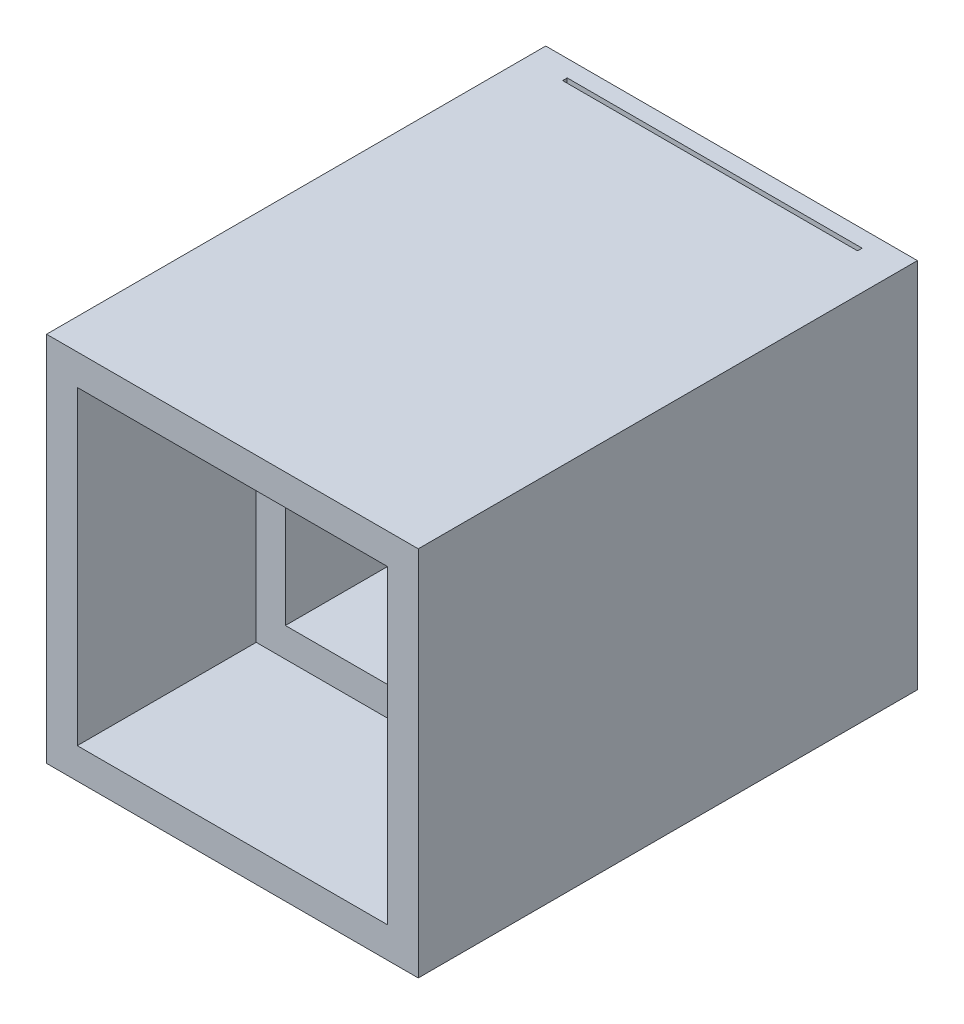
ISO-10303-21;
HEADER;
FILE_DESCRIPTION(('STEP AP214'),'2;1');
FILE_NAME('part.step','',(''),(''),'','','');
FILE_SCHEMA(('AUTOMOTIVE_DESIGN { 1 0 10303 214 1 1 1 1 }'));
ENDSEC;
DATA;
#1=APPLICATION_CONTEXT('core data for automotive mechanical design processes');
#2=APPLICATION_PROTOCOL_DEFINITION('international standard','automotive_design',2000,#1);
#3=PRODUCT_CONTEXT('',#1,'mechanical');
#4=PRODUCT('Part','Part','',(#3));
#5=PRODUCT_RELATED_PRODUCT_CATEGORY('part','',(#4));
#6=PRODUCT_DEFINITION_FORMATION('','',#4);
#7=PRODUCT_DEFINITION_CONTEXT('part definition',#1,'design');
#8=PRODUCT_DEFINITION('design','',#6,#7);
#9=PRODUCT_DEFINITION_SHAPE('','',#8);
#10=(LENGTH_UNIT() NAMED_UNIT(*) SI_UNIT(.MILLI.,.METRE.));
#11=(NAMED_UNIT(*) PLANE_ANGLE_UNIT() SI_UNIT($,.RADIAN.));
#12=(NAMED_UNIT(*) SI_UNIT($,.STERADIAN.) SOLID_ANGLE_UNIT());
#13=UNCERTAINTY_MEASURE_WITH_UNIT(LENGTH_MEASURE(1.E-05),#10,'distance_accuracy_value','');
#14=(GEOMETRIC_REPRESENTATION_CONTEXT(3) GLOBAL_UNCERTAINTY_ASSIGNED_CONTEXT((#13)) GLOBAL_UNIT_ASSIGNED_CONTEXT((#10,
#11,#12)) REPRESENTATION_CONTEXT('',''));
#15=CARTESIAN_POINT('',(0.,0.,0.));
#16=DIRECTION('',(0.,0.,1.));
#17=DIRECTION('',(1.,0.,0.));
#18=AXIS2_PLACEMENT_3D('',#15,#16,#17);
#19=CARTESIAN_POINT('',(-4.572,4.572,76.2));
#20=DIRECTION('',(-1.,0.,0.));
#21=DIRECTION('',(0.,-1.,0.));
#22=AXIS2_PLACEMENT_3D('',#19,#20,#21);
#23=PLANE('',#22);
#24=DIRECTION('',(0.,0.,-1.));
#25=VECTOR('',#24,1.);
#26=CARTESIAN_POINT('',(-4.572,4.572,76.2));
#27=LINE('',#26,#25);
#28=CARTESIAN_POINT('',(-4.572,4.572,-3.55600000000002));
#29=VERTEX_POINT('',#28);
#30=CARTESIAN_POINT('',(-4.572,4.572,-6.35));
#31=VERTEX_POINT('',#30);
#32=EDGE_CURVE('E263',#29,#31,#27,.T.);
#33=ORIENTED_EDGE('',*,*,#32,.F.);
#34=DIRECTION('',(0.,-1.,0.));
#35=VECTOR('',#34,1.);
#36=CARTESIAN_POINT('',(-4.572,4.572,-3.55600000000002));
#37=LINE('',#36,#35);
#38=CARTESIAN_POINT('',(-4.572,-4.572,-3.55600000000002));
#39=VERTEX_POINT('',#38);
#40=EDGE_CURVE('E248',#29,#39,#37,.T.);
#41=ORIENTED_EDGE('',*,*,#40,.T.);
#42=DIRECTION('',(0.,0.,-1.));
#43=VECTOR('',#42,1.);
#44=CARTESIAN_POINT('',(-4.572,-4.572,76.2));
#45=LINE('',#44,#43);
#46=CARTESIAN_POINT('',(-4.572,-4.572,-6.35));
#47=VERTEX_POINT('',#46);
#48=EDGE_CURVE('E268',#39,#47,#45,.T.);
#49=ORIENTED_EDGE('',*,*,#48,.T.);
#50=DIRECTION('',(0.,1.,0.));
#51=VECTOR('',#50,1.);
#52=CARTESIAN_POINT('',(-4.572,4.572,-6.35));
#53=LINE('',#52,#51);
#54=EDGE_CURVE('E251',#47,#31,#53,.T.);
#55=ORIENTED_EDGE('',*,*,#54,.T.);
#56=EDGE_LOOP('',(#33,#41,#49,#55));
#57=FACE_BOUND('',#56,.T.);
#58=ADVANCED_FACE('F35',(#57),#23,.F.);
#59=CARTESIAN_POINT('',(4.572,-4.572,76.2));
#60=DIRECTION('',(0.,-1.,0.));
#61=DIRECTION('',(0.,0.,-1.));
#62=AXIS2_PLACEMENT_3D('',#59,#60,#61);
#63=PLANE('',#62);
#64=ORIENTED_EDGE('',*,*,#48,.F.);
#65=DIRECTION('',(1.,0.,0.));
#66=VECTOR('',#65,1.);
#67=CARTESIAN_POINT('',(4.572,-4.572,-3.55600000000002));
#68=LINE('',#67,#66);
#69=CARTESIAN_POINT('',(4.572,-4.572,-3.55600000000002));
#70=VERTEX_POINT('',#69);
#71=EDGE_CURVE('E245',#39,#70,#68,.T.);
#72=ORIENTED_EDGE('',*,*,#71,.T.);
#73=DIRECTION('',(0.,0.,-1.));
#74=VECTOR('',#73,1.);
#75=CARTESIAN_POINT('',(4.572,-4.572,76.2));
#76=LINE('',#75,#74);
#77=CARTESIAN_POINT('',(4.572,-4.572,-6.35));
#78=VERTEX_POINT('',#77);
#79=EDGE_CURVE('E272',#70,#78,#76,.T.);
#80=ORIENTED_EDGE('',*,*,#79,.T.);
#81=DIRECTION('',(-1.,0.,0.));
#82=VECTOR('',#81,1.);
#83=CARTESIAN_POINT('',(4.572,-4.572,-6.35));
#84=LINE('',#83,#82);
#85=EDGE_CURVE('E260',#78,#47,#84,.T.);
#86=ORIENTED_EDGE('',*,*,#85,.T.);
#87=EDGE_LOOP('',(#64,#72,#80,#86));
#88=FACE_BOUND('',#87,.T.);
#89=ADVANCED_FACE('F398',(#88),#63,.F.);
#90=CARTESIAN_POINT('',(4.572,4.572,76.2));
#91=DIRECTION('',(1.,0.,0.));
#92=DIRECTION('',(0.,1.,0.));
#93=AXIS2_PLACEMENT_3D('',#90,#91,#92);
#94=PLANE('',#93);
#95=ORIENTED_EDGE('',*,*,#79,.F.);
#96=DIRECTION('',(0.,1.,0.));
#97=VECTOR('',#96,1.);
#98=CARTESIAN_POINT('',(4.572,4.572,-3.55600000000002));
#99=LINE('',#98,#97);
#100=CARTESIAN_POINT('',(4.572,4.572,-3.55600000000002));
#101=VERTEX_POINT('',#100);
#102=EDGE_CURVE('E242',#70,#101,#99,.T.);
#103=ORIENTED_EDGE('',*,*,#102,.T.);
#104=DIRECTION('',(0.,0.,-1.));
#105=VECTOR('',#104,1.);
#106=CARTESIAN_POINT('',(4.572,4.572,76.2));
#107=LINE('',#106,#105);
#108=CARTESIAN_POINT('',(4.572,4.572,-6.35));
#109=VERTEX_POINT('',#108);
#110=EDGE_CURVE('E276',#101,#109,#107,.T.);
#111=ORIENTED_EDGE('',*,*,#110,.T.);
#112=DIRECTION('',(0.,-1.,0.));
#113=VECTOR('',#112,1.);
#114=CARTESIAN_POINT('',(4.572,4.572,-6.35));
#115=LINE('',#114,#113);
#116=EDGE_CURVE('E257',#109,#78,#115,.T.);
#117=ORIENTED_EDGE('',*,*,#116,.T.);
#118=EDGE_LOOP('',(#95,#103,#111,#117));
#119=FACE_BOUND('',#118,.T.);
#120=ADVANCED_FACE('F404',(#119),#94,.F.);
#121=CARTESIAN_POINT('',(4.572,4.572,76.2));
#122=DIRECTION('',(0.,1.,0.));
#123=DIRECTION('',(0.,0.,1.));
#124=AXIS2_PLACEMENT_3D('',#121,#122,#123);
#125=PLANE('',#124);
#126=ORIENTED_EDGE('',*,*,#110,.F.);
#127=DIRECTION('',(-1.,0.,0.));
#128=VECTOR('',#127,1.);
#129=CARTESIAN_POINT('',(4.572,4.572,-3.55600000000002));
#130=LINE('',#129,#128);
#131=EDGE_CURVE('E12',#101,#29,#130,.T.);
#132=ORIENTED_EDGE('',*,*,#131,.T.);
#133=ORIENTED_EDGE('',*,*,#32,.T.);
#134=DIRECTION('',(1.,0.,0.));
#135=VECTOR('',#134,1.);
#136=CARTESIAN_POINT('',(4.572,4.572,-6.35));
#137=LINE('',#136,#135);
#138=EDGE_CURVE('E254',#31,#109,#137,.T.);
#139=ORIENTED_EDGE('',*,*,#138,.T.);
#140=EDGE_LOOP('',(#126,#132,#133,#139));
#141=FACE_BOUND('',#140,.T.);
#142=ADVANCED_FACE('F459',(#141),#125,.F.);
#143=CARTESIAN_POINT('',(0.,0.,76.2));
#144=DIRECTION('',(0.,0.,1.));
#145=DIRECTION('',(1.,0.,0.));
#146=AXIS2_PLACEMENT_3D('',#143,#144,#145);
#147=PLANE('',#146);
#148=DIRECTION('',(0.,-1.,0.));
#149=VECTOR('',#148,1.);
#150=CARTESIAN_POINT('',(-30.734,30.734,76.2));
#151=LINE('',#150,#149);
#152=CARTESIAN_POINT('',(-30.734,30.734,76.2));
#153=VERTEX_POINT('',#152);
#154=CARTESIAN_POINT('',(-30.734,-30.734,76.2));
#155=VERTEX_POINT('',#154);
#156=EDGE_CURVE('E337',#153,#155,#151,.T.);
#157=ORIENTED_EDGE('',*,*,#156,.T.);
#158=DIRECTION('',(1.,0.,0.));
#159=VECTOR('',#158,1.);
#160=CARTESIAN_POINT('',(-30.734,-30.734,76.2));
#161=LINE('',#160,#159);
#162=CARTESIAN_POINT('',(30.734,-30.734,76.2));
#163=VERTEX_POINT('',#162);
#164=EDGE_CURVE('E340',#155,#163,#161,.T.);
#165=ORIENTED_EDGE('',*,*,#164,.T.);
#166=DIRECTION('',(0.,-1.,0.));
#167=VECTOR('',#166,1.);
#168=CARTESIAN_POINT('',(30.734,30.734,76.2));
#169=LINE('',#168,#167);
#170=CARTESIAN_POINT('',(30.734,30.734,76.2));
#171=VERTEX_POINT('',#170);
#172=EDGE_CURVE('E343',#171,#163,#169,.T.);
#173=ORIENTED_EDGE('',*,*,#172,.F.);
#174=DIRECTION('',(1.,0.,0.));
#175=VECTOR('',#174,1.);
#176=CARTESIAN_POINT('',(-30.734,30.734,76.2));
#177=LINE('',#176,#175);
#178=EDGE_CURVE('E346',#153,#171,#177,.T.);
#179=ORIENTED_EDGE('',*,*,#178,.F.);
#180=EDGE_LOOP('',(#157,#165,#173,#179));
#181=FACE_BOUND('',#180,.T.);
#182=DIRECTION('',(-1.,0.,0.));
#183=VECTOR('',#182,1.);
#184=CARTESIAN_POINT('',(-25.654,25.654,76.2));
#185=LINE('',#184,#183);
#186=CARTESIAN_POINT('',(25.654,25.654,76.2));
#187=VERTEX_POINT('',#186);
#188=CARTESIAN_POINT('',(-25.654,25.654,76.2));
#189=VERTEX_POINT('',#188);
#190=EDGE_CURVE('E282',#187,#189,#185,.T.);
#191=ORIENTED_EDGE('',*,*,#190,.F.);
#192=DIRECTION('',(0.,1.,0.));
#193=VECTOR('',#192,1.);
#194=CARTESIAN_POINT('',(25.654,25.654,76.2));
#195=LINE('',#194,#193);
#196=CARTESIAN_POINT('',(25.654,-25.654,76.2));
#197=VERTEX_POINT('',#196);
#198=EDGE_CURVE('E280',#197,#187,#195,.T.);
#199=ORIENTED_EDGE('',*,*,#198,.F.);
#200=DIRECTION('',(1.,0.,0.));
#201=VECTOR('',#200,1.);
#202=CARTESIAN_POINT('',(-25.654,-25.654,76.2));
#203=LINE('',#202,#201);
#204=CARTESIAN_POINT('',(-25.654,-25.654,76.2));
#205=VERTEX_POINT('',#204);
#206=EDGE_CURVE('E288',#205,#197,#203,.T.);
#207=ORIENTED_EDGE('',*,*,#206,.F.);
#208=DIRECTION('',(0.,-1.,0.));
#209=VECTOR('',#208,1.);
#210=CARTESIAN_POINT('',(-25.654,25.654,76.2));
#211=LINE('',#210,#209);
#212=EDGE_CURVE('E285',#189,#205,#211,.T.);
#213=ORIENTED_EDGE('',*,*,#212,.F.);
#214=EDGE_LOOP('',(#191,#199,#207,#213));
#215=FACE_BOUND('',#214,.T.);
#216=ADVANCED_FACE('F456',(#181,#215),#147,.T.);
#217=CARTESIAN_POINT('',(-30.734,30.734,-6.35));
#218=DIRECTION('',(-1.,0.,0.));
#219=DIRECTION('',(0.,-1.,0.));
#220=AXIS2_PLACEMENT_3D('',#217,#218,#219);
#221=PLANE('',#220);
#222=DIRECTION('',(0.,0.,1.));
#223=VECTOR('',#222,1.);
#224=CARTESIAN_POINT('',(-30.734,-30.734,-6.35));
#225=LINE('',#224,#223);
#226=CARTESIAN_POINT('',(-30.734,-30.734,-6.35));
#227=VERTEX_POINT('',#226);
#228=EDGE_CURVE('E359',#227,#155,#225,.T.);
#229=ORIENTED_EDGE('',*,*,#228,.T.);
#230=ORIENTED_EDGE('',*,*,#156,.F.);
#231=DIRECTION('',(0.,0.,1.));
#232=VECTOR('',#231,1.);
#233=CARTESIAN_POINT('',(-30.734,30.734,-6.35));
#234=LINE('',#233,#232);
#235=CARTESIAN_POINT('',(-30.734,30.734,-6.35));
#236=VERTEX_POINT('',#235);
#237=EDGE_CURVE('E360',#236,#153,#234,.T.);
#238=ORIENTED_EDGE('',*,*,#237,.F.);
#239=DIRECTION('',(0.,-1.,0.));
#240=VECTOR('',#239,1.);
#241=CARTESIAN_POINT('',(-30.734,30.734,-6.35));
#242=LINE('',#241,#240);
#243=EDGE_CURVE('E349',#236,#227,#242,.T.);
#244=ORIENTED_EDGE('',*,*,#243,.T.);
#245=EDGE_LOOP('',(#229,#230,#238,#244));
#246=FACE_BOUND('',#245,.T.);
#247=ADVANCED_FACE('F37',(#246),#221,.T.);
#248=CARTESIAN_POINT('',(-30.734,30.734,-6.35));
#249=DIRECTION('',(0.,-1.,0.));
#250=DIRECTION('',(0.,0.,-1.));
#251=AXIS2_PLACEMENT_3D('',#248,#249,#250);
#252=PLANE('',#251);
#253=DIRECTION('',(0.,0.,1.));
#254=VECTOR('',#253,1.);
#255=CARTESIAN_POINT('',(-24.384,30.734,-3.55600000000001));
#256=LINE('',#255,#254);
#257=CARTESIAN_POINT('',(-24.384,30.734,-3.55600000000001));
#258=VERTEX_POINT('',#257);
#259=CARTESIAN_POINT('',(-24.384,30.734,-2.79400000000001));
#260=VERTEX_POINT('',#259);
#261=EDGE_CURVE('E221',#258,#260,#256,.T.);
#262=ORIENTED_EDGE('',*,*,#261,.F.);
#263=DIRECTION('',(-1.,0.,0.));
#264=VECTOR('',#263,1.);
#265=CARTESIAN_POINT('',(-24.384,30.734,-3.55600000000001));
#266=LINE('',#265,#264);
#267=CARTESIAN_POINT('',(24.384,30.734,-3.55600000000001));
#268=VERTEX_POINT('',#267);
#269=EDGE_CURVE('E214',#268,#258,#266,.T.);
#270=ORIENTED_EDGE('',*,*,#269,.F.);
#271=DIRECTION('',(0.,0.,-1.));
#272=VECTOR('',#271,1.);
#273=CARTESIAN_POINT('',(24.384,30.734,-3.55600000000001));
#274=LINE('',#273,#272);
#275=CARTESIAN_POINT('',(24.384,30.734,-2.79400000000001));
#276=VERTEX_POINT('',#275);
#277=EDGE_CURVE('E225',#276,#268,#274,.T.);
#278=ORIENTED_EDGE('',*,*,#277,.F.);
#279=DIRECTION('',(1.,0.,0.));
#280=VECTOR('',#279,1.);
#281=CARTESIAN_POINT('',(-24.384,30.734,-2.79400000000001));
#282=LINE('',#281,#280);
#283=EDGE_CURVE('E50',#260,#276,#282,.T.);
#284=ORIENTED_EDGE('',*,*,#283,.F.);
#285=EDGE_LOOP('',(#262,#270,#278,#284));
#286=FACE_BOUND('',#285,.T.);
#287=ORIENTED_EDGE('',*,*,#237,.T.);
#288=ORIENTED_EDGE('',*,*,#178,.T.);
#289=DIRECTION('',(0.,0.,1.));
#290=VECTOR('',#289,1.);
#291=CARTESIAN_POINT('',(30.734,30.734,-6.35));
#292=LINE('',#291,#290);
#293=CARTESIAN_POINT('',(30.734,30.734,-6.35));
#294=VERTEX_POINT('',#293);
#295=EDGE_CURVE('E363',#294,#171,#292,.T.);
#296=ORIENTED_EDGE('',*,*,#295,.F.);
#297=DIRECTION('',(1.,0.,0.));
#298=VECTOR('',#297,1.);
#299=CARTESIAN_POINT('',(-30.734,30.734,-6.35));
#300=LINE('',#299,#298);
#301=EDGE_CURVE('E357',#236,#294,#300,.T.);
#302=ORIENTED_EDGE('',*,*,#301,.F.);
#303=EDGE_LOOP('',(#287,#288,#296,#302));
#304=FACE_BOUND('',#303,.T.);
#305=ADVANCED_FACE('F465',(#286,#304),#252,.F.);
#306=CARTESIAN_POINT('',(30.734,30.734,-6.35));
#307=DIRECTION('',(-1.,0.,0.));
#308=DIRECTION('',(0.,-1.,0.));
#309=AXIS2_PLACEMENT_3D('',#306,#307,#308);
#310=PLANE('',#309);
#311=ORIENTED_EDGE('',*,*,#295,.T.);
#312=ORIENTED_EDGE('',*,*,#172,.T.);
#313=DIRECTION('',(0.,0.,1.));
#314=VECTOR('',#313,1.);
#315=CARTESIAN_POINT('',(30.734,-30.734,-6.35));
#316=LINE('',#315,#314);
#317=CARTESIAN_POINT('',(30.734,-30.734,-6.35));
#318=VERTEX_POINT('',#317);
#319=EDGE_CURVE('E365',#318,#163,#316,.T.);
#320=ORIENTED_EDGE('',*,*,#319,.F.);
#321=DIRECTION('',(0.,-1.,0.));
#322=VECTOR('',#321,1.);
#323=CARTESIAN_POINT('',(30.734,30.734,-6.35));
#324=LINE('',#323,#322);
#325=EDGE_CURVE('E355',#294,#318,#324,.T.);
#326=ORIENTED_EDGE('',*,*,#325,.F.);
#327=EDGE_LOOP('',(#311,#312,#320,#326));
#328=FACE_BOUND('',#327,.T.);
#329=ADVANCED_FACE('F468',(#328),#310,.F.);
#330=CARTESIAN_POINT('',(-30.734,-30.734,-6.35));
#331=DIRECTION('',(0.,-1.,0.));
#332=DIRECTION('',(1.,0.,0.));
#333=AXIS2_PLACEMENT_3D('',#330,#331,#332);
#334=PLANE('',#333);
#335=ORIENTED_EDGE('',*,*,#319,.T.);
#336=ORIENTED_EDGE('',*,*,#164,.F.);
#337=ORIENTED_EDGE('',*,*,#228,.F.);
#338=DIRECTION('',(1.,0.,0.));
#339=VECTOR('',#338,1.);
#340=CARTESIAN_POINT('',(-30.734,-30.734,-6.35));
#341=LINE('',#340,#339);
#342=EDGE_CURVE('E352',#227,#318,#341,.T.);
#343=ORIENTED_EDGE('',*,*,#342,.T.);
#344=EDGE_LOOP('',(#335,#336,#337,#343));
#345=FACE_BOUND('',#344,.T.);
#346=ADVANCED_FACE('F463',(#345),#334,.T.);
#347=CARTESIAN_POINT('',(0.,0.,-6.35));
#348=DIRECTION('',(0.,0.,1.));
#349=DIRECTION('',(1.,0.,0.));
#350=AXIS2_PLACEMENT_3D('',#347,#348,#349);
#351=PLANE('',#350);
#352=ORIENTED_EDGE('',*,*,#138,.F.);
#353=ORIENTED_EDGE('',*,*,#54,.F.);
#354=ORIENTED_EDGE('',*,*,#85,.F.);
#355=ORIENTED_EDGE('',*,*,#116,.F.);
#356=EDGE_LOOP('',(#352,#353,#354,#355));
#357=FACE_BOUND('',#356,.T.);
#358=ORIENTED_EDGE('',*,*,#243,.F.);
#359=ORIENTED_EDGE('',*,*,#301,.T.);
#360=ORIENTED_EDGE('',*,*,#325,.T.);
#361=ORIENTED_EDGE('',*,*,#342,.F.);
#362=EDGE_LOOP('',(#358,#359,#360,#361));
#363=FACE_BOUND('',#362,.T.);
#364=ADVANCED_FACE('F437',(#357,#363),#351,.F.);
#365=CARTESIAN_POINT('',(25.654,25.654,76.2));
#366=DIRECTION('',(-1.,0.,0.));
#367=DIRECTION('',(0.,0.,1.));
#368=AXIS2_PLACEMENT_3D('',#365,#366,#367);
#369=PLANE('',#368);
#370=DIRECTION('',(0.,1.,0.));
#371=VECTOR('',#370,1.);
#372=CARTESIAN_POINT('',(25.654,25.654,46.609));
#373=LINE('',#372,#371);
#374=CARTESIAN_POINT('',(25.654,-25.654,46.609));
#375=VERTEX_POINT('',#374);
#376=CARTESIAN_POINT('',(25.654,25.654,46.609));
#377=VERTEX_POINT('',#376);
#378=EDGE_CURVE('E267',#375,#377,#373,.T.);
#379=ORIENTED_EDGE('',*,*,#378,.F.);
#380=DIRECTION('',(0.,0.,-1.));
#381=VECTOR('',#380,1.);
#382=CARTESIAN_POINT('',(25.654,-25.654,76.2));
#383=LINE('',#382,#381);
#384=EDGE_CURVE('E290',#197,#375,#383,.T.);
#385=ORIENTED_EDGE('',*,*,#384,.F.);
#386=ORIENTED_EDGE('',*,*,#198,.T.);
#387=DIRECTION('',(0.,0.,-1.));
#388=VECTOR('',#387,1.);
#389=CARTESIAN_POINT('',(25.654,25.654,76.2));
#390=LINE('',#389,#388);
#391=EDGE_CURVE('E306',#187,#377,#390,.T.);
#392=ORIENTED_EDGE('',*,*,#391,.T.);
#393=EDGE_LOOP('',(#379,#385,#386,#392));
#394=FACE_BOUND('',#393,.T.);
#395=ADVANCED_FACE('F433',(#394),#369,.T.);
#396=CARTESIAN_POINT('',(-25.654,25.654,76.2));
#397=DIRECTION('',(0.,-1.,0.));
#398=DIRECTION('',(0.,0.,-1.));
#399=AXIS2_PLACEMENT_3D('',#396,#397,#398);
#400=PLANE('',#399);
#401=DIRECTION('',(-1.,0.,0.));
#402=VECTOR('',#401,1.);
#403=CARTESIAN_POINT('',(-25.654,25.654,46.609));
#404=LINE('',#403,#402);
#405=CARTESIAN_POINT('',(-25.654,25.654,46.609));
#406=VERTEX_POINT('',#405);
#407=EDGE_CURVE('E293',#377,#406,#404,.T.);
#408=ORIENTED_EDGE('',*,*,#407,.F.);
#409=ORIENTED_EDGE('',*,*,#391,.F.);
#410=ORIENTED_EDGE('',*,*,#190,.T.);
#411=DIRECTION('',(0.,0.,-1.));
#412=VECTOR('',#411,1.);
#413=CARTESIAN_POINT('',(-25.654,25.654,76.2));
#414=LINE('',#413,#412);
#415=EDGE_CURVE('E303',#189,#406,#414,.T.);
#416=ORIENTED_EDGE('',*,*,#415,.T.);
#417=EDGE_LOOP('',(#408,#409,#410,#416));
#418=FACE_BOUND('',#417,.T.);
#419=ADVANCED_FACE('F429',(#418),#400,.T.);
#420=CARTESIAN_POINT('',(-25.654,25.654,76.2));
#421=DIRECTION('',(1.,0.,0.));
#422=DIRECTION('',(0.,0.,-1.));
#423=AXIS2_PLACEMENT_3D('',#420,#421,#422);
#424=PLANE('',#423);
#425=DIRECTION('',(0.,-1.,0.));
#426=VECTOR('',#425,1.);
#427=CARTESIAN_POINT('',(-25.654,25.654,46.609));
#428=LINE('',#427,#426);
#429=CARTESIAN_POINT('',(-25.654,-25.654,46.609));
#430=VERTEX_POINT('',#429);
#431=EDGE_CURVE('E295',#406,#430,#428,.T.);
#432=ORIENTED_EDGE('',*,*,#431,.F.);
#433=ORIENTED_EDGE('',*,*,#415,.F.);
#434=ORIENTED_EDGE('',*,*,#212,.T.);
#435=DIRECTION('',(0.,0.,-1.));
#436=VECTOR('',#435,1.);
#437=CARTESIAN_POINT('',(-25.654,-25.654,76.2));
#438=LINE('',#437,#436);
#439=EDGE_CURVE('E300',#205,#430,#438,.T.);
#440=ORIENTED_EDGE('',*,*,#439,.T.);
#441=EDGE_LOOP('',(#432,#433,#434,#440));
#442=FACE_BOUND('',#441,.T.);
#443=ADVANCED_FACE('F425',(#442),#424,.T.);
#444=CARTESIAN_POINT('',(-25.654,-25.654,76.2));
#445=DIRECTION('',(0.,1.,0.));
#446=DIRECTION('',(0.,0.,1.));
#447=AXIS2_PLACEMENT_3D('',#444,#445,#446);
#448=PLANE('',#447);
#449=DIRECTION('',(1.,0.,0.));
#450=VECTOR('',#449,1.);
#451=CARTESIAN_POINT('',(-25.654,-25.654,46.609));
#452=LINE('',#451,#450);
#453=EDGE_CURVE('E283',#430,#375,#452,.T.);
#454=ORIENTED_EDGE('',*,*,#453,.F.);
#455=ORIENTED_EDGE('',*,*,#439,.F.);
#456=ORIENTED_EDGE('',*,*,#206,.T.);
#457=ORIENTED_EDGE('',*,*,#384,.T.);
#458=EDGE_LOOP('',(#454,#455,#456,#457));
#459=FACE_BOUND('',#458,.T.);
#460=ADVANCED_FACE('F421',(#459),#448,.T.);
#461=CARTESIAN_POINT('',(0.,0.,46.609));
#462=DIRECTION('',(0.,0.,1.));
#463=DIRECTION('',(1.,0.,0.));
#464=AXIS2_PLACEMENT_3D('',#461,#462,#463);
#465=PLANE('',#464);
#466=DIRECTION('',(1.,0.,0.));
#467=VECTOR('',#466,1.);
#468=CARTESIAN_POINT('',(-20.828,20.828,46.609));
#469=LINE('',#468,#467);
#470=CARTESIAN_POINT('',(-20.828,20.828,46.609));
#471=VERTEX_POINT('',#470);
#472=CARTESIAN_POINT('',(20.828,20.828,46.609));
#473=VERTEX_POINT('',#472);
#474=EDGE_CURVE('E362',#471,#473,#469,.T.);
#475=ORIENTED_EDGE('',*,*,#474,.T.);
#476=DIRECTION('',(0.,-1.,0.));
#477=VECTOR('',#476,1.);
#478=CARTESIAN_POINT('',(20.828,20.828,46.609));
#479=LINE('',#478,#477);
#480=CARTESIAN_POINT('',(20.828,-20.828,46.609));
#481=VERTEX_POINT('',#480);
#482=EDGE_CURVE('E309',#473,#481,#479,.T.);
#483=ORIENTED_EDGE('',*,*,#482,.T.);
#484=DIRECTION('',(1.,0.,0.));
#485=VECTOR('',#484,1.);
#486=CARTESIAN_POINT('',(-20.828,-20.828,46.609));
#487=LINE('',#486,#485);
#488=CARTESIAN_POINT('',(-20.828,-20.828,46.609));
#489=VERTEX_POINT('',#488);
#490=EDGE_CURVE('E311',#489,#481,#487,.T.);
#491=ORIENTED_EDGE('',*,*,#490,.F.);
#492=DIRECTION('',(0.,-1.,0.));
#493=VECTOR('',#492,1.);
#494=CARTESIAN_POINT('',(-20.828,20.828,46.609));
#495=LINE('',#494,#493);
#496=EDGE_CURVE('E314',#471,#489,#495,.T.);
#497=ORIENTED_EDGE('',*,*,#496,.F.);
#498=EDGE_LOOP('',(#475,#483,#491,#497));
#499=FACE_BOUND('',#498,.T.);
#500=ORIENTED_EDGE('',*,*,#378,.T.);
#501=ORIENTED_EDGE('',*,*,#407,.T.);
#502=ORIENTED_EDGE('',*,*,#431,.T.);
#503=ORIENTED_EDGE('',*,*,#453,.T.);
#504=EDGE_LOOP('',(#500,#501,#502,#503));
#505=FACE_BOUND('',#504,.T.);
#506=ADVANCED_FACE('F418',(#499,#505),#465,.T.);
#507=CARTESIAN_POINT('',(0.,0.,0.));
#508=DIRECTION('',(0.,0.,1.));
#509=DIRECTION('',(1.,0.,0.));
#510=AXIS2_PLACEMENT_3D('',#507,#508,#509);
#511=PLANE('',#510);
#512=DIRECTION('',(0.,-1.,0.));
#513=VECTOR('',#512,1.);
#514=CARTESIAN_POINT('',(-4.572,0.,0.));
#515=LINE('',#514,#513);
#516=CARTESIAN_POINT('',(-4.572,4.572,0.));
#517=VERTEX_POINT('',#516);
#518=CARTESIAN_POINT('',(-4.572,-4.572,0.));
#519=VERTEX_POINT('',#518);
#520=EDGE_CURVE('E376',#517,#519,#515,.T.);
#521=ORIENTED_EDGE('',*,*,#520,.F.);
#522=DIRECTION('',(-1.,0.,0.));
#523=VECTOR('',#522,1.);
#524=CARTESIAN_POINT('',(0.,4.572,0.));
#525=LINE('',#524,#523);
#526=CARTESIAN_POINT('',(4.572,4.572,0.));
#527=VERTEX_POINT('',#526);
#528=EDGE_CURVE('E369',#527,#517,#525,.T.);
#529=ORIENTED_EDGE('',*,*,#528,.F.);
#530=DIRECTION('',(0.,1.,0.));
#531=VECTOR('',#530,1.);
#532=CARTESIAN_POINT('',(4.572,0.,0.));
#533=LINE('',#532,#531);
#534=CARTESIAN_POINT('',(4.572,-4.572,0.));
#535=VERTEX_POINT('',#534);
#536=EDGE_CURVE('E371',#535,#527,#533,.T.);
#537=ORIENTED_EDGE('',*,*,#536,.F.);
#538=DIRECTION('',(1.,0.,0.));
#539=VECTOR('',#538,1.);
#540=CARTESIAN_POINT('',(0.,-4.572,0.));
#541=LINE('',#540,#539);
#542=EDGE_CURVE('E374',#519,#535,#541,.T.);
#543=ORIENTED_EDGE('',*,*,#542,.F.);
#544=EDGE_LOOP('',(#521,#529,#537,#543));
#545=FACE_BOUND('',#544,.T.);
#546=DIRECTION('',(0.,-1.,0.));
#547=VECTOR('',#546,1.);
#548=CARTESIAN_POINT('',(-20.828,20.828,0.));
#549=LINE('',#548,#547);
#550=CARTESIAN_POINT('',(-20.828,20.828,0.));
#551=VERTEX_POINT('',#550);
#552=CARTESIAN_POINT('',(-20.828,-20.828,0.));
#553=VERTEX_POINT('',#552);
#554=EDGE_CURVE('E317',#551,#553,#549,.T.);
#555=ORIENTED_EDGE('',*,*,#554,.T.);
#556=DIRECTION('',(1.,0.,0.));
#557=VECTOR('',#556,1.);
#558=CARTESIAN_POINT('',(-20.828,-20.828,0.));
#559=LINE('',#558,#557);
#560=CARTESIAN_POINT('',(20.828,-20.828,0.));
#561=VERTEX_POINT('',#560);
#562=EDGE_CURVE('E320',#553,#561,#559,.T.);
#563=ORIENTED_EDGE('',*,*,#562,.T.);
#564=DIRECTION('',(0.,-1.,0.));
#565=VECTOR('',#564,1.);
#566=CARTESIAN_POINT('',(20.828,20.828,0.));
#567=LINE('',#566,#565);
#568=CARTESIAN_POINT('',(20.828,20.828,0.));
#569=VERTEX_POINT('',#568);
#570=EDGE_CURVE('E323',#569,#561,#567,.T.);
#571=ORIENTED_EDGE('',*,*,#570,.F.);
#572=DIRECTION('',(1.,0.,0.));
#573=VECTOR('',#572,1.);
#574=CARTESIAN_POINT('',(-20.828,20.828,0.));
#575=LINE('',#574,#573);
#576=EDGE_CURVE('E326',#551,#569,#575,.T.);
#577=ORIENTED_EDGE('',*,*,#576,.F.);
#578=EDGE_LOOP('',(#555,#563,#571,#577));
#579=FACE_BOUND('',#578,.T.);
#580=ADVANCED_FACE('F388',(#545,#579),#511,.T.);
#581=CARTESIAN_POINT('',(-20.828,20.828,76.2));
#582=DIRECTION('',(0.,1.,0.));
#583=DIRECTION('',(0.,0.,1.));
#584=AXIS2_PLACEMENT_3D('',#581,#582,#583);
#585=PLANE('',#584);
#586=ORIENTED_EDGE('',*,*,#474,.F.);
#587=DIRECTION('',(0.,0.,-1.));
#588=VECTOR('',#587,1.);
#589=CARTESIAN_POINT('',(-20.828,20.828,76.2));
#590=LINE('',#589,#588);
#591=EDGE_CURVE('E329',#471,#551,#590,.T.);
#592=ORIENTED_EDGE('',*,*,#591,.T.);
#593=ORIENTED_EDGE('',*,*,#576,.T.);
#594=DIRECTION('',(0.,0.,-1.));
#595=VECTOR('',#594,1.);
#596=CARTESIAN_POINT('',(20.828,20.828,76.2));
#597=LINE('',#596,#595);
#598=EDGE_CURVE('E331',#473,#569,#597,.T.);
#599=ORIENTED_EDGE('',*,*,#598,.F.);
#600=EDGE_LOOP('',(#586,#592,#593,#599));
#601=FACE_BOUND('',#600,.T.);
#602=ADVANCED_FACE('F441',(#601),#585,.F.);
#603=CARTESIAN_POINT('',(20.828,20.828,76.2));
#604=DIRECTION('',(1.,0.,0.));
#605=DIRECTION('',(0.,1.,0.));
#606=AXIS2_PLACEMENT_3D('',#603,#604,#605);
#607=PLANE('',#606);
#608=ORIENTED_EDGE('',*,*,#482,.F.);
#609=ORIENTED_EDGE('',*,*,#598,.T.);
#610=ORIENTED_EDGE('',*,*,#570,.T.);
#611=DIRECTION('',(0.,0.,-1.));
#612=VECTOR('',#611,1.);
#613=CARTESIAN_POINT('',(20.828,-20.828,76.2));
#614=LINE('',#613,#612);
#615=EDGE_CURVE('E333',#481,#561,#614,.T.);
#616=ORIENTED_EDGE('',*,*,#615,.F.);
#617=EDGE_LOOP('',(#608,#609,#610,#616));
#618=FACE_BOUND('',#617,.T.);
#619=ADVANCED_FACE('F444',(#618),#607,.F.);
#620=CARTESIAN_POINT('',(-20.828,-20.828,76.2));
#621=DIRECTION('',(0.,1.,0.));
#622=DIRECTION('',(0.,0.,1.));
#623=AXIS2_PLACEMENT_3D('',#620,#621,#622);
#624=PLANE('',#623);
#625=DIRECTION('',(0.,0.,-1.));
#626=VECTOR('',#625,1.);
#627=CARTESIAN_POINT('',(-20.828,-20.828,76.2));
#628=LINE('',#627,#626);
#629=EDGE_CURVE('E335',#489,#553,#628,.T.);
#630=ORIENTED_EDGE('',*,*,#629,.F.);
#631=ORIENTED_EDGE('',*,*,#490,.T.);
#632=ORIENTED_EDGE('',*,*,#615,.T.);
#633=ORIENTED_EDGE('',*,*,#562,.F.);
#634=EDGE_LOOP('',(#630,#631,#632,#633));
#635=FACE_BOUND('',#634,.T.);
#636=ADVANCED_FACE('F448',(#635),#624,.T.);
#637=CARTESIAN_POINT('',(-20.828,20.828,76.2));
#638=DIRECTION('',(1.,0.,0.));
#639=DIRECTION('',(0.,1.,0.));
#640=AXIS2_PLACEMENT_3D('',#637,#638,#639);
#641=PLANE('',#640);
#642=ORIENTED_EDGE('',*,*,#591,.F.);
#643=ORIENTED_EDGE('',*,*,#496,.T.);
#644=ORIENTED_EDGE('',*,*,#629,.T.);
#645=ORIENTED_EDGE('',*,*,#554,.F.);
#646=EDGE_LOOP('',(#642,#643,#644,#645));
#647=FACE_BOUND('',#646,.T.);
#648=ADVANCED_FACE('F405',(#647),#641,.T.);
#649=CARTESIAN_POINT('',(-4.572,-4.572,-2.794));
#650=VERTEX_POINT('',#649);
#651=EDGE_CURVE('E264',#519,#650,#45,.T.);
#652=ORIENTED_EDGE('',*,*,#651,.T.);
#653=DIRECTION('',(0.,1.,0.));
#654=VECTOR('',#653,1.);
#655=CARTESIAN_POINT('',(-4.572,4.572,-2.794));
#656=LINE('',#655,#654);
#657=CARTESIAN_POINT('',(-4.572,4.572,-2.794));
#658=VERTEX_POINT('',#657);
#659=EDGE_CURVE('E239',#650,#658,#656,.T.);
#660=ORIENTED_EDGE('',*,*,#659,.T.);
#661=EDGE_CURVE('E277',#517,#658,#27,.T.);
#662=ORIENTED_EDGE('',*,*,#661,.F.);
#663=ORIENTED_EDGE('',*,*,#520,.T.);
#664=EDGE_LOOP('',(#652,#660,#662,#663));
#665=FACE_BOUND('',#664,.T.);
#666=ADVANCED_FACE('F391',(#665),#23,.F.);
#667=CARTESIAN_POINT('',(4.572,-4.572,-2.794));
#668=VERTEX_POINT('',#667);
#669=EDGE_CURVE('E269',#535,#668,#76,.T.);
#670=ORIENTED_EDGE('',*,*,#669,.T.);
#671=DIRECTION('',(-1.,0.,0.));
#672=VECTOR('',#671,1.);
#673=CARTESIAN_POINT('',(4.572,-4.572,-2.794));
#674=LINE('',#673,#672);
#675=EDGE_CURVE('E236',#668,#650,#674,.T.);
#676=ORIENTED_EDGE('',*,*,#675,.T.);
#677=ORIENTED_EDGE('',*,*,#651,.F.);
#678=ORIENTED_EDGE('',*,*,#542,.T.);
#679=EDGE_LOOP('',(#670,#676,#677,#678));
#680=FACE_BOUND('',#679,.T.);
#681=ADVANCED_FACE('F395',(#680),#63,.F.);
#682=CARTESIAN_POINT('',(4.572,4.572,-2.794));
#683=VERTEX_POINT('',#682);
#684=EDGE_CURVE('E273',#527,#683,#107,.T.);
#685=ORIENTED_EDGE('',*,*,#684,.T.);
#686=DIRECTION('',(0.,-1.,0.));
#687=VECTOR('',#686,1.);
#688=CARTESIAN_POINT('',(4.572,4.572,-2.794));
#689=LINE('',#688,#687);
#690=EDGE_CURVE('E58',#683,#668,#689,.T.);
#691=ORIENTED_EDGE('',*,*,#690,.T.);
#692=ORIENTED_EDGE('',*,*,#669,.F.);
#693=ORIENTED_EDGE('',*,*,#536,.T.);
#694=EDGE_LOOP('',(#685,#691,#692,#693));
#695=FACE_BOUND('',#694,.T.);
#696=ADVANCED_FACE('F381',(#695),#94,.F.);
#697=ORIENTED_EDGE('',*,*,#661,.T.);
#698=DIRECTION('',(1.,0.,0.));
#699=VECTOR('',#698,1.);
#700=CARTESIAN_POINT('',(4.572,4.572,-2.794));
#701=LINE('',#700,#699);
#702=EDGE_CURVE('E43',#658,#683,#701,.T.);
#703=ORIENTED_EDGE('',*,*,#702,.T.);
#704=ORIENTED_EDGE('',*,*,#684,.F.);
#705=ORIENTED_EDGE('',*,*,#528,.T.);
#706=EDGE_LOOP('',(#697,#703,#704,#705));
#707=FACE_BOUND('',#706,.T.);
#708=ADVANCED_FACE('F378',(#707),#125,.F.);
#709=CARTESIAN_POINT('',(-24.384,-79.5079527616944,-3.55600000000001));
#710=DIRECTION('',(0.,0.,-1.));
#711=DIRECTION('',(-1.,0.,0.));
#712=AXIS2_PLACEMENT_3D('',#709,#710,#711);
#713=PLANE('',#712);
#714=DIRECTION('',(0.,1.,0.));
#715=VECTOR('',#714,1.);
#716=CARTESIAN_POINT('',(24.384,-79.5079527616944,-3.55600000000001));
#717=LINE('',#716,#715);
#718=CARTESIAN_POINT('',(24.384,-24.384,-3.55600000000001));
#719=VERTEX_POINT('',#718);
#720=EDGE_CURVE('E228',#719,#268,#717,.T.);
#721=ORIENTED_EDGE('',*,*,#720,.T.);
#722=ORIENTED_EDGE('',*,*,#269,.T.);
#723=DIRECTION('',(0.,1.,0.));
#724=VECTOR('',#723,1.);
#725=CARTESIAN_POINT('',(-24.384,-79.5079527616944,-3.55600000000001));
#726=LINE('',#725,#724);
#727=CARTESIAN_POINT('',(-24.384,-24.384,-3.55600000000001));
#728=VERTEX_POINT('',#727);
#729=EDGE_CURVE('E201',#728,#258,#726,.T.);
#730=ORIENTED_EDGE('',*,*,#729,.F.);
#731=DIRECTION('',(-1.,0.,0.));
#732=VECTOR('',#731,1.);
#733=CARTESIAN_POINT('',(-24.384,-24.384,-3.55600000000001));
#734=LINE('',#733,#732);
#735=EDGE_CURVE('E211',#719,#728,#734,.T.);
#736=ORIENTED_EDGE('',*,*,#735,.F.);
#737=EDGE_LOOP('',(#721,#722,#730,#736));
#738=FACE_BOUND('',#737,.T.);
#739=ORIENTED_EDGE('',*,*,#131,.F.);
#740=ORIENTED_EDGE('',*,*,#102,.F.);
#741=ORIENTED_EDGE('',*,*,#71,.F.);
#742=ORIENTED_EDGE('',*,*,#40,.F.);
#743=EDGE_LOOP('',(#739,#740,#741,#742));
#744=FACE_BOUND('',#743,.T.);
#745=ADVANCED_FACE('F209',(#738,#744),#713,.F.);
#746=CARTESIAN_POINT('',(-24.384,-79.5079527616944,-2.79400000000001));
#747=DIRECTION('',(0.,0.,1.));
#748=DIRECTION('',(1.,0.,0.));
#749=AXIS2_PLACEMENT_3D('',#746,#747,#748);
#750=PLANE('',#749);
#751=DIRECTION('',(0.,1.,0.));
#752=VECTOR('',#751,1.);
#753=CARTESIAN_POINT('',(-24.384,-79.5079527616944,-2.79400000000001));
#754=LINE('',#753,#752);
#755=CARTESIAN_POINT('',(-24.384,-24.384,-2.79400000000001));
#756=VERTEX_POINT('',#755);
#757=EDGE_CURVE('E203',#756,#260,#754,.T.);
#758=ORIENTED_EDGE('',*,*,#757,.T.);
#759=ORIENTED_EDGE('',*,*,#283,.T.);
#760=DIRECTION('',(0.,1.,0.));
#761=VECTOR('',#760,1.);
#762=CARTESIAN_POINT('',(24.384,-79.5079527616944,-2.79400000000001));
#763=LINE('',#762,#761);
#764=CARTESIAN_POINT('',(24.384,-24.384,-2.79400000000001));
#765=VERTEX_POINT('',#764);
#766=EDGE_CURVE('E229',#765,#276,#763,.T.);
#767=ORIENTED_EDGE('',*,*,#766,.F.);
#768=DIRECTION('',(1.,0.,0.));
#769=VECTOR('',#768,1.);
#770=CARTESIAN_POINT('',(-24.384,-24.384,-2.79400000000001));
#771=LINE('',#770,#769);
#772=EDGE_CURVE('E230',#756,#765,#771,.T.);
#773=ORIENTED_EDGE('',*,*,#772,.F.);
#774=EDGE_LOOP('',(#758,#759,#767,#773));
#775=FACE_BOUND('',#774,.T.);
#776=ORIENTED_EDGE('',*,*,#675,.F.);
#777=ORIENTED_EDGE('',*,*,#690,.F.);
#778=ORIENTED_EDGE('',*,*,#702,.F.);
#779=ORIENTED_EDGE('',*,*,#659,.F.);
#780=EDGE_LOOP('',(#776,#777,#778,#779));
#781=FACE_BOUND('',#780,.T.);
#782=ADVANCED_FACE('F393',(#775,#781),#750,.F.);
#783=CARTESIAN_POINT('',(-30.734,-24.384,-6.35));
#784=DIRECTION('',(0.,-1.,0.));
#785=DIRECTION('',(1.,0.,0.));
#786=AXIS2_PLACEMENT_3D('',#783,#784,#785);
#787=PLANE('',#786);
#788=DIRECTION('',(0.,0.,-1.));
#789=VECTOR('',#788,1.);
#790=CARTESIAN_POINT('',(24.384,-24.384,-3.55600000000001));
#791=LINE('',#790,#789);
#792=EDGE_CURVE('E218',#765,#719,#791,.T.);
#793=ORIENTED_EDGE('',*,*,#792,.T.);
#794=ORIENTED_EDGE('',*,*,#735,.T.);
#795=DIRECTION('',(0.,0.,1.));
#796=VECTOR('',#795,1.);
#797=CARTESIAN_POINT('',(-24.384,-24.384,-3.55600000000001));
#798=LINE('',#797,#796);
#799=EDGE_CURVE('E197',#728,#756,#798,.T.);
#800=ORIENTED_EDGE('',*,*,#799,.T.);
#801=ORIENTED_EDGE('',*,*,#772,.T.);
#802=EDGE_LOOP('',(#793,#794,#800,#801));
#803=FACE_BOUND('',#802,.T.);
#804=ADVANCED_FACE('F217',(#803),#787,.F.);
#805=CARTESIAN_POINT('',(-24.384,-79.5079527616944,-3.55600000000001));
#806=DIRECTION('',(-1.,0.,0.));
#807=DIRECTION('',(0.,0.,1.));
#808=AXIS2_PLACEMENT_3D('',#805,#806,#807);
#809=PLANE('',#808);
#810=ORIENTED_EDGE('',*,*,#729,.T.);
#811=ORIENTED_EDGE('',*,*,#261,.T.);
#812=ORIENTED_EDGE('',*,*,#757,.F.);
#813=ORIENTED_EDGE('',*,*,#799,.F.);
#814=EDGE_LOOP('',(#810,#811,#812,#813));
#815=FACE_BOUND('',#814,.T.);
#816=ADVANCED_FACE('F199',(#815),#809,.F.);
#817=CARTESIAN_POINT('',(24.384,-79.5079527616944,-3.55600000000001));
#818=DIRECTION('',(1.,0.,0.));
#819=DIRECTION('',(0.,0.,-1.));
#820=AXIS2_PLACEMENT_3D('',#817,#818,#819);
#821=PLANE('',#820);
#822=ORIENTED_EDGE('',*,*,#766,.T.);
#823=ORIENTED_EDGE('',*,*,#277,.T.);
#824=ORIENTED_EDGE('',*,*,#720,.F.);
#825=ORIENTED_EDGE('',*,*,#792,.F.);
#826=EDGE_LOOP('',(#822,#823,#824,#825));
#827=FACE_BOUND('',#826,.T.);
#828=ADVANCED_FACE('F649',(#827),#821,.F.);
#829=CLOSED_SHELL('',(#58,#89,#120,#142,#216,#247,#305,#329,#346,#364,#395,#419,#443,#460,#506,
#580,#602,#619,#636,#648,#666,#681,#696,#708,#745,#782,#804,#816,#828));
#830=MANIFOLD_SOLID_BREP('B2',#829);
#831=ADVANCED_BREP_SHAPE_REPRESENTATION('',(#18,#830),#14);
#832=SHAPE_DEFINITION_REPRESENTATION(#9,#831);
ENDSEC;
END-ISO-10303-21;
